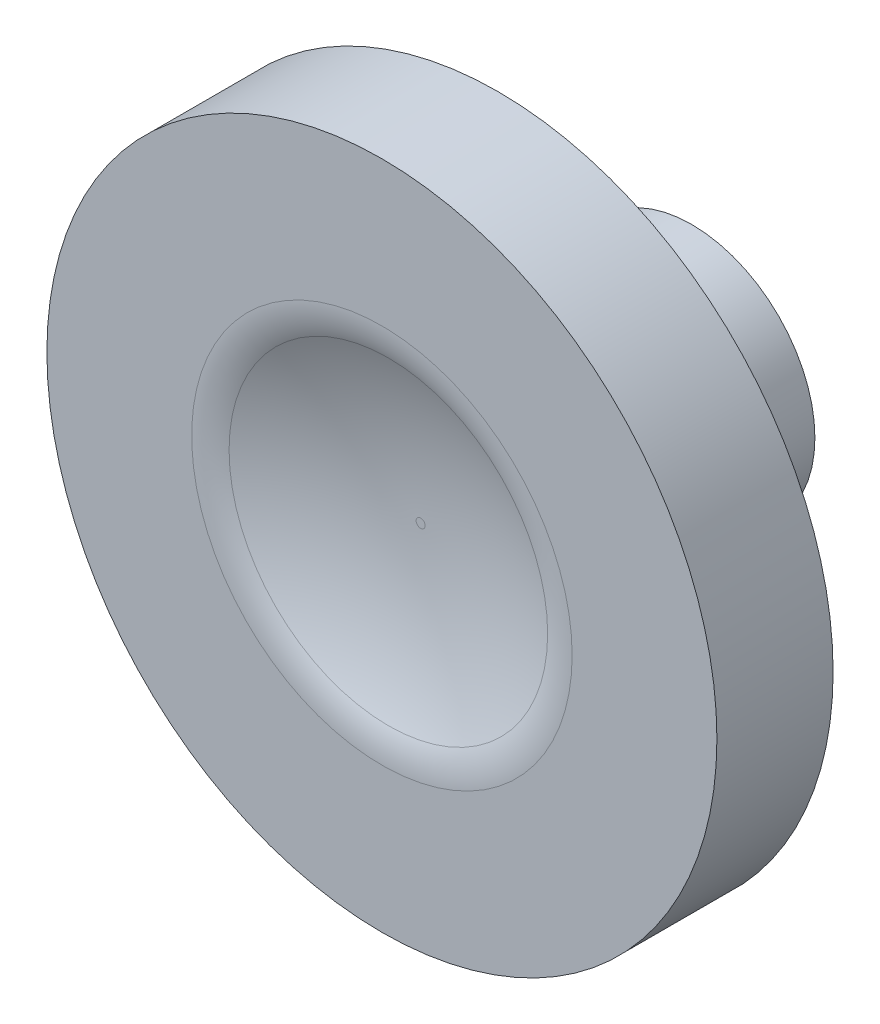
ISO-10303-21;
HEADER;
FILE_DESCRIPTION(('STEP AP214'),'2;1');
FILE_NAME('part.step','',(''),(''),'','','');
FILE_SCHEMA(('AUTOMOTIVE_DESIGN { 1 0 10303 214 1 1 1 1 }'));
ENDSEC;
DATA;
#1=APPLICATION_CONTEXT('core data for automotive mechanical design processes');
#2=APPLICATION_PROTOCOL_DEFINITION('international standard','automotive_design',2000,#1);
#3=PRODUCT_CONTEXT('',#1,'mechanical');
#4=PRODUCT('Part','Part','',(#3));
#5=PRODUCT_RELATED_PRODUCT_CATEGORY('part','',(#4));
#6=PRODUCT_DEFINITION_FORMATION('','',#4);
#7=PRODUCT_DEFINITION_CONTEXT('part definition',#1,'design');
#8=PRODUCT_DEFINITION('design','',#6,#7);
#9=PRODUCT_DEFINITION_SHAPE('','',#8);
#10=(LENGTH_UNIT() NAMED_UNIT(*) SI_UNIT(.MILLI.,.METRE.));
#11=(NAMED_UNIT(*) PLANE_ANGLE_UNIT() SI_UNIT($,.RADIAN.));
#12=(NAMED_UNIT(*) SI_UNIT($,.STERADIAN.) SOLID_ANGLE_UNIT());
#13=UNCERTAINTY_MEASURE_WITH_UNIT(LENGTH_MEASURE(1.E-05),#10,'distance_accuracy_value','');
#14=(GEOMETRIC_REPRESENTATION_CONTEXT(3) GLOBAL_UNCERTAINTY_ASSIGNED_CONTEXT((#13)) GLOBAL_UNIT_ASSIGNED_CONTEXT((#10,
#11,#12)) REPRESENTATION_CONTEXT('',''));
#15=CARTESIAN_POINT('',(0.,0.,0.));
#16=DIRECTION('',(0.,0.,1.));
#17=DIRECTION('',(1.,0.,0.));
#18=AXIS2_PLACEMENT_3D('',#15,#16,#17);
#19=CARTESIAN_POINT('',(0.,0.,2.54));
#20=DIRECTION('',(0.,0.,1.));
#21=DIRECTION('',(1.,0.,0.));
#22=AXIS2_PLACEMENT_3D('',#19,#20,#21);
#23=PLANE('',#22);
#24=CARTESIAN_POINT('',(0.,0.,2.54));
#25=DIRECTION('',(0.,0.,1.));
#26=DIRECTION('',(1.,0.,0.));
#27=AXIS2_PLACEMENT_3D('',#24,#25,#26);
#28=CIRCLE('',#27,0.14759849100532);
#29=CARTESIAN_POINT('',(0.14759849100532,0.,2.54));
#30=VERTEX_POINT('',#29);
#31=EDGE_CURVE('E10',#30,#30,#28,.T.);
#32=ORIENTED_EDGE('',*,*,#31,.T.);
#33=EDGE_LOOP('',(#32));
#34=FACE_BOUND('',#33,.T.);
#35=ADVANCED_FACE('F37',(#34),#23,.T.);
#36=CARTESIAN_POINT('',(0.,0.,3.81));
#37=DIRECTION('',(0.,0.,1.));
#38=DIRECTION('',(1.,0.,0.));
#39=AXIS2_PLACEMENT_3D('',#36,#37,#38);
#40=PLANE('',#39);
#41=CARTESIAN_POINT('',(0.,0.,3.81));
#42=DIRECTION('',(0.,0.,1.));
#43=DIRECTION('',(1.,0.,0.));
#44=AXIS2_PLACEMENT_3D('',#41,#42,#43);
#45=CIRCLE('',#44,6.23830452561247);
#46=CARTESIAN_POINT('',(6.23830452561247,0.,3.81));
#47=VERTEX_POINT('',#46);
#48=EDGE_CURVE('E48',#47,#47,#45,.F.);
#49=ORIENTED_EDGE('',*,*,#48,.T.);
#50=EDGE_LOOP('',(#49));
#51=FACE_BOUND('',#50,.T.);
#52=CARTESIAN_POINT('',(0.,0.,3.81));
#53=DIRECTION('',(0.,0.,1.));
#54=DIRECTION('',(1.,0.,0.));
#55=AXIS2_PLACEMENT_3D('',#52,#53,#54);
#56=CIRCLE('',#55,10.9855);
#57=CARTESIAN_POINT('',(-10.9855,0.,3.81));
#58=VERTEX_POINT('',#57);
#59=EDGE_CURVE('E52',#58,#58,#56,.T.);
#60=ORIENTED_EDGE('',*,*,#59,.T.);
#61=EDGE_LOOP('',(#60));
#62=FACE_BOUND('',#61,.T.);
#63=ADVANCED_FACE('F102',(#51,#62),#40,.T.);
#64=CARTESIAN_POINT('',(0.,0.,3.81));
#65=DIRECTION('',(0.,0.,-1.));
#66=DIRECTION('',(-1.,0.,0.));
#67=AXIS2_PLACEMENT_3D('',#64,#65,#66);
#68=CYLINDRICAL_SURFACE('',#67,10.9855);
#69=CARTESIAN_POINT('',(0.,0.,0.));
#70=DIRECTION('',(0.,0.,1.));
#71=DIRECTION('',(1.,0.,0.));
#72=AXIS2_PLACEMENT_3D('',#69,#70,#71);
#73=CIRCLE('',#72,10.9855);
#74=CARTESIAN_POINT('',(-10.9855,0.,0.));
#75=VERTEX_POINT('',#74);
#76=EDGE_CURVE('E55',#75,#75,#73,.T.);
#77=CARTESIAN_POINT('',(-10.9855,0.,3.81));
#78=CARTESIAN_POINT('',(-10.9855,0.,3.7703125));
#79=CARTESIAN_POINT('',(-10.9855,0.,3.730625));
#80=CARTESIAN_POINT('',(-10.9855,0.,3.65125));
#81=CARTESIAN_POINT('',(-10.9855,0.,3.6115625));
#82=CARTESIAN_POINT('',(-10.9855,0.,3.5321875));
#83=CARTESIAN_POINT('',(-10.9855,0.,3.4925));
#84=CARTESIAN_POINT('',(-10.9855,0.,3.413125));
#85=CARTESIAN_POINT('',(-10.9855,0.,3.3734375));
#86=CARTESIAN_POINT('',(-10.9855,0.,3.2940625));
#87=CARTESIAN_POINT('',(-10.9855,0.,3.254375));
#88=CARTESIAN_POINT('',(-10.9855,0.,3.175));
#89=CARTESIAN_POINT('',(-10.9855,0.,3.1353125));
#90=CARTESIAN_POINT('',(-10.9855,0.,3.0559375));
#91=CARTESIAN_POINT('',(-10.9855,0.,3.01625));
#92=CARTESIAN_POINT('',(-10.9855,0.,2.936875));
#93=CARTESIAN_POINT('',(-10.9855,0.,2.8971875));
#94=CARTESIAN_POINT('',(-10.9855,0.,2.8178125));
#95=CARTESIAN_POINT('',(-10.9855,0.,2.778125));
#96=CARTESIAN_POINT('',(-10.9855,0.,2.69875));
#97=CARTESIAN_POINT('',(-10.9855,0.,2.6590625));
#98=CARTESIAN_POINT('',(-10.9855,0.,2.5796875));
#99=CARTESIAN_POINT('',(-10.9855,0.,2.54));
#100=CARTESIAN_POINT('',(-10.9855,0.,2.460625));
#101=CARTESIAN_POINT('',(-10.9855,0.,2.4209375));
#102=CARTESIAN_POINT('',(-10.9855,0.,2.3415625));
#103=CARTESIAN_POINT('',(-10.9855,0.,2.301875));
#104=CARTESIAN_POINT('',(-10.9855,0.,2.2225));
#105=CARTESIAN_POINT('',(-10.9855,0.,2.1828125));
#106=CARTESIAN_POINT('',(-10.9855,0.,2.1034375));
#107=CARTESIAN_POINT('',(-10.9855,0.,2.06375));
#108=CARTESIAN_POINT('',(-10.9855,0.,1.984375));
#109=CARTESIAN_POINT('',(-10.9855,0.,1.9446875));
#110=CARTESIAN_POINT('',(-10.9855,0.,1.8653125));
#111=CARTESIAN_POINT('',(-10.9855,0.,1.825625));
#112=CARTESIAN_POINT('',(-10.9855,0.,1.74625));
#113=CARTESIAN_POINT('',(-10.9855,0.,1.7065625));
#114=CARTESIAN_POINT('',(-10.9855,0.,1.6271875));
#115=CARTESIAN_POINT('',(-10.9855,0.,1.5875));
#116=CARTESIAN_POINT('',(-10.9855,0.,1.508125));
#117=CARTESIAN_POINT('',(-10.9855,0.,1.4684375));
#118=CARTESIAN_POINT('',(-10.9855,0.,1.3890625));
#119=CARTESIAN_POINT('',(-10.9855,0.,1.349375));
#120=CARTESIAN_POINT('',(-10.9855,0.,1.27));
#121=CARTESIAN_POINT('',(-10.9855,0.,1.2303125));
#122=CARTESIAN_POINT('',(-10.9855,0.,1.1509375));
#123=CARTESIAN_POINT('',(-10.9855,0.,1.11125));
#124=CARTESIAN_POINT('',(-10.9855,0.,1.031875));
#125=CARTESIAN_POINT('',(-10.9855,0.,0.9921875));
#126=CARTESIAN_POINT('',(-10.9855,0.,0.9128125));
#127=CARTESIAN_POINT('',(-10.9855,0.,0.873125));
#128=CARTESIAN_POINT('',(-10.9855,0.,0.79375));
#129=CARTESIAN_POINT('',(-10.9855,0.,0.7540625));
#130=CARTESIAN_POINT('',(-10.9855,0.,0.6746875));
#131=CARTESIAN_POINT('',(-10.9855,0.,0.635));
#132=CARTESIAN_POINT('',(-10.9855,0.,0.555625));
#133=CARTESIAN_POINT('',(-10.9855,0.,0.5159375));
#134=CARTESIAN_POINT('',(-10.9855,0.,0.4365625));
#135=CARTESIAN_POINT('',(-10.9855,0.,0.396875));
#136=CARTESIAN_POINT('',(-10.9855,0.,0.3175));
#137=CARTESIAN_POINT('',(-10.9855,0.,0.2778125));
#138=CARTESIAN_POINT('',(-10.9855,0.,0.1984375));
#139=CARTESIAN_POINT('',(-10.9855,0.,0.15875));
#140=CARTESIAN_POINT('',(-10.9855,0.,0.0793749999999999));
#141=CARTESIAN_POINT('',(-10.9855,0.,0.0396874999999999));
#142=CARTESIAN_POINT('',(-10.9855,0.,0.));
#143=B_SPLINE_CURVE_WITH_KNOTS('',3,(#77,#78,#79,#80,#81,#82,#83,#84,#85,#86,#87,#88,#89,#90,
#91,#92,#93,#94,#95,#96,#97,#98,#99,#100,#101,#102,#103,#104,#105,#106,#107,#108,#109,#110,#111,
#112,#113,#114,#115,#116,#117,#118,#119,#120,#121,#122,#123,#124,#125,#126,#127,#128,#129,#130,
#131,#132,#133,#134,#135,#136,#137,#138,#139,#140,#141,#142),.UNSPECIFIED.,.F.,.F.,(4,2,2,2,2,2,
2,2,2,2,2,2,2,2,2,2,2,2,2,2,2,2,2,2,2,2,2,2,2,2,2,2,4),(0.,0.1190625,0.238125,0.3571875,0.47625,
0.5953125,0.714375,0.8334375,0.9525,1.0715625,1.190625,1.3096875,1.42875,1.5478125,1.666875,
1.7859375,1.905,2.0240625,2.143125,2.2621875,2.38125,2.5003125,2.619375,2.7384375,2.8575,
2.9765625,3.095625,3.2146875,3.33375,3.4528125,3.571875,3.6909375,3.81),.UNSPECIFIED.);
#144=EDGE_CURVE('BSEAM97',#58,#75,#143,.T.);
#145=ORIENTED_EDGE('',*,*,#59,.F.);
#146=ORIENTED_EDGE('',*,*,#76,.T.);
#147=ORIENTED_EDGE('',*,*,#144,.T.);
#148=ORIENTED_EDGE('',*,*,#144,.F.);
#149=EDGE_LOOP('',(#145,#147,#146,#148));
#150=FACE_BOUND('',#149,.T.);
#151=ADVANCED_FACE('F97',(#150),#68,.T.);
#152=CARTESIAN_POINT('',(0.,0.,0.));
#153=DIRECTION('',(0.,0.,1.));
#154=DIRECTION('',(1.,0.,0.));
#155=AXIS2_PLACEMENT_3D('',#152,#153,#154);
#156=PLANE('',#155);
#157=CARTESIAN_POINT('',(0.,0.,0.));
#158=DIRECTION('',(0.,0.,1.));
#159=DIRECTION('',(1.,0.,0.));
#160=AXIS2_PLACEMENT_3D('',#157,#158,#159);
#161=CIRCLE('',#160,4.0386);
#162=CARTESIAN_POINT('',(4.0386,0.,0.));
#163=VERTEX_POINT('',#162);
#164=EDGE_CURVE('E61',#163,#163,#161,.T.);
#165=ORIENTED_EDGE('',*,*,#164,.T.);
#166=EDGE_LOOP('',(#165));
#167=FACE_BOUND('',#166,.T.);
#168=ORIENTED_EDGE('',*,*,#76,.F.);
#169=EDGE_LOOP('',(#168));
#170=FACE_BOUND('',#169,.T.);
#171=ADVANCED_FACE('F93',(#167,#170),#156,.F.);
#172=CARTESIAN_POINT('',(0.,0.,1.27));
#173=DIRECTION('',(0.,0.,1.));
#174=DIRECTION('',(1.,0.,0.));
#175=AXIS2_PLACEMENT_3D('',#172,#173,#174);
#176=TOROIDAL_SURFACE('',#175,6.23830452561247,2.54);
#177=CARTESIAN_POINT('',(0.,0.,3.59833333333333));
#178=DIRECTION('',(0.,0.,-1.));
#179=DIRECTION('',(-1.,0.,0.));
#180=AXIS2_PLACEMENT_3D('',#177,#178,#179);
#181=CIRCLE('',#180,5.22318685317795);
#182=CARTESIAN_POINT('',(-5.22318685317795,0.,3.59833333333333));
#183=VERTEX_POINT('',#182);
#184=EDGE_CURVE('E44',#183,#183,#181,.T.);
#185=ORIENTED_EDGE('',*,*,#184,.T.);
#186=EDGE_LOOP('',(#185));
#187=FACE_BOUND('',#186,.T.);
#188=ORIENTED_EDGE('',*,*,#48,.F.);
#189=EDGE_LOOP('',(#188));
#190=FACE_BOUND('',#189,.T.);
#191=ADVANCED_FACE('F96',(#187,#190),#176,.T.);
#192=CARTESIAN_POINT('',(0.,0.,15.24));
#193=DIRECTION('',(0.,0.,-1.));
#194=DIRECTION('',(-1.,0.,0.));
#195=AXIS2_PLACEMENT_3D('',#192,#193,#194);
#196=DEGENERATE_TOROIDAL_SURFACE('',#195,0.14759849100532,12.7,.T.);
#197=ORIENTED_EDGE('',*,*,#31,.F.);
#198=EDGE_LOOP('',(#197));
#199=FACE_BOUND('',#198,.T.);
#200=ORIENTED_EDGE('',*,*,#184,.F.);
#201=EDGE_LOOP('',(#200));
#202=FACE_BOUND('',#201,.T.);
#203=ADVANCED_FACE('F39',(#199,#202),#196,.F.);
#204=CARTESIAN_POINT('',(0.,0.,-6.35));
#205=DIRECTION('',(0.,0.,1.));
#206=DIRECTION('',(1.,0.,0.));
#207=AXIS2_PLACEMENT_3D('',#204,#205,#206);
#208=CYLINDRICAL_SURFACE('',#207,4.0386);
#209=CARTESIAN_POINT('',(0.,0.,-6.35));
#210=DIRECTION('',(0.,0.,1.));
#211=DIRECTION('',(1.,0.,0.));
#212=AXIS2_PLACEMENT_3D('',#209,#210,#211);
#213=CIRCLE('',#212,4.0386);
#214=CARTESIAN_POINT('',(4.0386,0.,-6.35));
#215=VERTEX_POINT('',#214);
#216=EDGE_CURVE('E58',#215,#215,#213,.T.);
#217=ORIENTED_EDGE('',*,*,#216,.T.);
#218=EDGE_LOOP('',(#217));
#219=FACE_BOUND('',#218,.T.);
#220=ORIENTED_EDGE('',*,*,#164,.F.);
#221=EDGE_LOOP('',(#220));
#222=FACE_BOUND('',#221,.T.);
#223=ADVANCED_FACE('F84',(#219,#222),#208,.T.);
#224=CARTESIAN_POINT('',(0.,0.,-6.35));
#225=DIRECTION('',(0.,0.,1.));
#226=DIRECTION('',(1.,0.,0.));
#227=AXIS2_PLACEMENT_3D('',#224,#225,#226);
#228=PLANE('',#227);
#229=CARTESIAN_POINT('',(0.,0.,-6.35));
#230=DIRECTION('',(0.,0.,-1.));
#231=DIRECTION('',(-1.,0.,0.));
#232=AXIS2_PLACEMENT_3D('',#229,#230,#231);
#233=CIRCLE('',#232,2.54);
#234=CARTESIAN_POINT('',(-2.54,0.,-6.35));
#235=VERTEX_POINT('',#234);
#236=EDGE_CURVE('E67',#235,#235,#233,.T.);
#237=ORIENTED_EDGE('',*,*,#236,.F.);
#238=EDGE_LOOP('',(#237));
#239=FACE_BOUND('',#238,.T.);
#240=ORIENTED_EDGE('',*,*,#216,.F.);
#241=EDGE_LOOP('',(#240));
#242=FACE_BOUND('',#241,.T.);
#243=ADVANCED_FACE('F78',(#239,#242),#228,.F.);
#244=CARTESIAN_POINT('',(0.,0.,-2.54));
#245=DIRECTION('',(0.,0.,-1.));
#246=DIRECTION('',(-1.,0.,0.));
#247=AXIS2_PLACEMENT_3D('',#244,#245,#246);
#248=CYLINDRICAL_SURFACE('',#247,2.54);
#249=CARTESIAN_POINT('',(0.,0.,-2.54));
#250=DIRECTION('',(0.,0.,-1.));
#251=DIRECTION('',(-1.,0.,0.));
#252=AXIS2_PLACEMENT_3D('',#249,#250,#251);
#253=CIRCLE('',#252,2.54);
#254=CARTESIAN_POINT('',(-2.54,0.,-2.54));
#255=VERTEX_POINT('',#254);
#256=EDGE_CURVE('E64',#255,#255,#253,.T.);
#257=CARTESIAN_POINT('',(-2.54,0.,-2.54));
#258=CARTESIAN_POINT('',(-2.54,0.,-2.5796875));
#259=CARTESIAN_POINT('',(-2.54,0.,-2.619375));
#260=CARTESIAN_POINT('',(-2.54,0.,-2.69875));
#261=CARTESIAN_POINT('',(-2.54,0.,-2.7384375));
#262=CARTESIAN_POINT('',(-2.54,0.,-2.8178125));
#263=CARTESIAN_POINT('',(-2.54,0.,-2.8575));
#264=CARTESIAN_POINT('',(-2.54,0.,-2.936875));
#265=CARTESIAN_POINT('',(-2.54,0.,-2.9765625));
#266=CARTESIAN_POINT('',(-2.54,0.,-3.0559375));
#267=CARTESIAN_POINT('',(-2.54,0.,-3.095625));
#268=CARTESIAN_POINT('',(-2.54,0.,-3.175));
#269=CARTESIAN_POINT('',(-2.54,0.,-3.2146875));
#270=CARTESIAN_POINT('',(-2.54,0.,-3.2940625));
#271=CARTESIAN_POINT('',(-2.54,0.,-3.33375));
#272=CARTESIAN_POINT('',(-2.54,0.,-3.413125));
#273=CARTESIAN_POINT('',(-2.54,0.,-3.4528125));
#274=CARTESIAN_POINT('',(-2.54,0.,-3.5321875));
#275=CARTESIAN_POINT('',(-2.54,0.,-3.571875));
#276=CARTESIAN_POINT('',(-2.54,0.,-3.65125));
#277=CARTESIAN_POINT('',(-2.54,0.,-3.6909375));
#278=CARTESIAN_POINT('',(-2.54,0.,-3.7703125));
#279=CARTESIAN_POINT('',(-2.54,0.,-3.81));
#280=CARTESIAN_POINT('',(-2.54,0.,-3.889375));
#281=CARTESIAN_POINT('',(-2.54,0.,-3.9290625));
#282=CARTESIAN_POINT('',(-2.54,0.,-4.0084375));
#283=CARTESIAN_POINT('',(-2.54,0.,-4.048125));
#284=CARTESIAN_POINT('',(-2.54,0.,-4.1275));
#285=CARTESIAN_POINT('',(-2.54,0.,-4.1671875));
#286=CARTESIAN_POINT('',(-2.54,0.,-4.2465625));
#287=CARTESIAN_POINT('',(-2.54,0.,-4.28625));
#288=CARTESIAN_POINT('',(-2.54,0.,-4.365625));
#289=CARTESIAN_POINT('',(-2.54,0.,-4.4053125));
#290=CARTESIAN_POINT('',(-2.54,0.,-4.4846875));
#291=CARTESIAN_POINT('',(-2.54,0.,-4.524375));
#292=CARTESIAN_POINT('',(-2.54,0.,-4.60375));
#293=CARTESIAN_POINT('',(-2.54,0.,-4.6434375));
#294=CARTESIAN_POINT('',(-2.54,0.,-4.7228125));
#295=CARTESIAN_POINT('',(-2.54,0.,-4.7625));
#296=CARTESIAN_POINT('',(-2.54,0.,-4.841875));
#297=CARTESIAN_POINT('',(-2.54,0.,-4.8815625));
#298=CARTESIAN_POINT('',(-2.54,0.,-4.9609375));
#299=CARTESIAN_POINT('',(-2.54,0.,-5.000625));
#300=CARTESIAN_POINT('',(-2.54,0.,-5.08));
#301=CARTESIAN_POINT('',(-2.54,0.,-5.1196875));
#302=CARTESIAN_POINT('',(-2.54,0.,-5.1990625));
#303=CARTESIAN_POINT('',(-2.54,0.,-5.23875));
#304=CARTESIAN_POINT('',(-2.54,0.,-5.318125));
#305=CARTESIAN_POINT('',(-2.54,0.,-5.3578125));
#306=CARTESIAN_POINT('',(-2.54,0.,-5.4371875));
#307=CARTESIAN_POINT('',(-2.54,0.,-5.476875));
#308=CARTESIAN_POINT('',(-2.54,0.,-5.55625));
#309=CARTESIAN_POINT('',(-2.54,0.,-5.5959375));
#310=CARTESIAN_POINT('',(-2.54,0.,-5.6753125));
#311=CARTESIAN_POINT('',(-2.54,0.,-5.715));
#312=CARTESIAN_POINT('',(-2.54,0.,-5.794375));
#313=CARTESIAN_POINT('',(-2.54,0.,-5.8340625));
#314=CARTESIAN_POINT('',(-2.54,0.,-5.9134375));
#315=CARTESIAN_POINT('',(-2.54,0.,-5.953125));
#316=CARTESIAN_POINT('',(-2.54,0.,-6.0325));
#317=CARTESIAN_POINT('',(-2.54,0.,-6.0721875));
#318=CARTESIAN_POINT('',(-2.54,0.,-6.1515625));
#319=CARTESIAN_POINT('',(-2.54,0.,-6.19125));
#320=CARTESIAN_POINT('',(-2.54,0.,-6.270625));
#321=CARTESIAN_POINT('',(-2.54,0.,-6.3103125));
#322=CARTESIAN_POINT('',(-2.54,0.,-6.35));
#323=B_SPLINE_CURVE_WITH_KNOTS('',3,(#257,#258,#259,#260,#261,#262,#263,#264,#265,#266,#267,
#268,#269,#270,#271,#272,#273,#274,#275,#276,#277,#278,#279,#280,#281,#282,#283,#284,#285,#286,
#287,#288,#289,#290,#291,#292,#293,#294,#295,#296,#297,#298,#299,#300,#301,#302,#303,#304,#305,
#306,#307,#308,#309,#310,#311,#312,#313,#314,#315,#316,#317,#318,#319,#320,#321,#322),
.UNSPECIFIED.,.F.,.F.,(4,2,2,2,2,2,2,2,2,2,2,2,2,2,2,2,2,2,2,2,2,2,2,2,2,2,2,2,2,2,2,2,4),(0.,
0.1190625,0.238125,0.357187499999999,0.47625,0.595312499999999,0.714374999999999,
0.833437499999999,0.952499999999999,1.0715625,1.190625,1.3096875,1.42875,1.5478125,1.666875,
1.7859375,1.905,2.0240625,2.143125,2.2621875,2.38125,2.5003125,2.619375,2.7384375,2.8575,
2.9765625,3.095625,3.2146875,3.33375,3.4528125,3.571875,3.6909375,3.81),.UNSPECIFIED.);
#324=EDGE_CURVE('BSEAM75',#255,#235,#323,.T.);
#325=ORIENTED_EDGE('',*,*,#256,.F.);
#326=ORIENTED_EDGE('',*,*,#236,.T.);
#327=ORIENTED_EDGE('',*,*,#324,.T.);
#328=ORIENTED_EDGE('',*,*,#324,.F.);
#329=EDGE_LOOP('',(#325,#327,#326,#328));
#330=FACE_BOUND('',#329,.T.);
#331=ADVANCED_FACE('F75',(#330),#248,.F.);
#332=CARTESIAN_POINT('',(0.,0.,-2.54));
#333=DIRECTION('',(0.,0.,-1.));
#334=DIRECTION('',(-1.,0.,0.));
#335=AXIS2_PLACEMENT_3D('',#332,#333,#334);
#336=PLANE('',#335);
#337=ORIENTED_EDGE('',*,*,#256,.T.);
#338=EDGE_LOOP('',(#337));
#339=FACE_BOUND('',#338,.T.);
#340=ADVANCED_FACE('F73',(#339),#336,.T.);
#341=CLOSED_SHELL('',(#35,#63,#151,#171,#191,#203,#223,#243,#331,#340));
#342=MANIFOLD_SOLID_BREP('B2',#341);
#343=ADVANCED_BREP_SHAPE_REPRESENTATION('',(#18,#342),#14);
#344=SHAPE_DEFINITION_REPRESENTATION(#9,#343);
ENDSEC;
END-ISO-10303-21;
